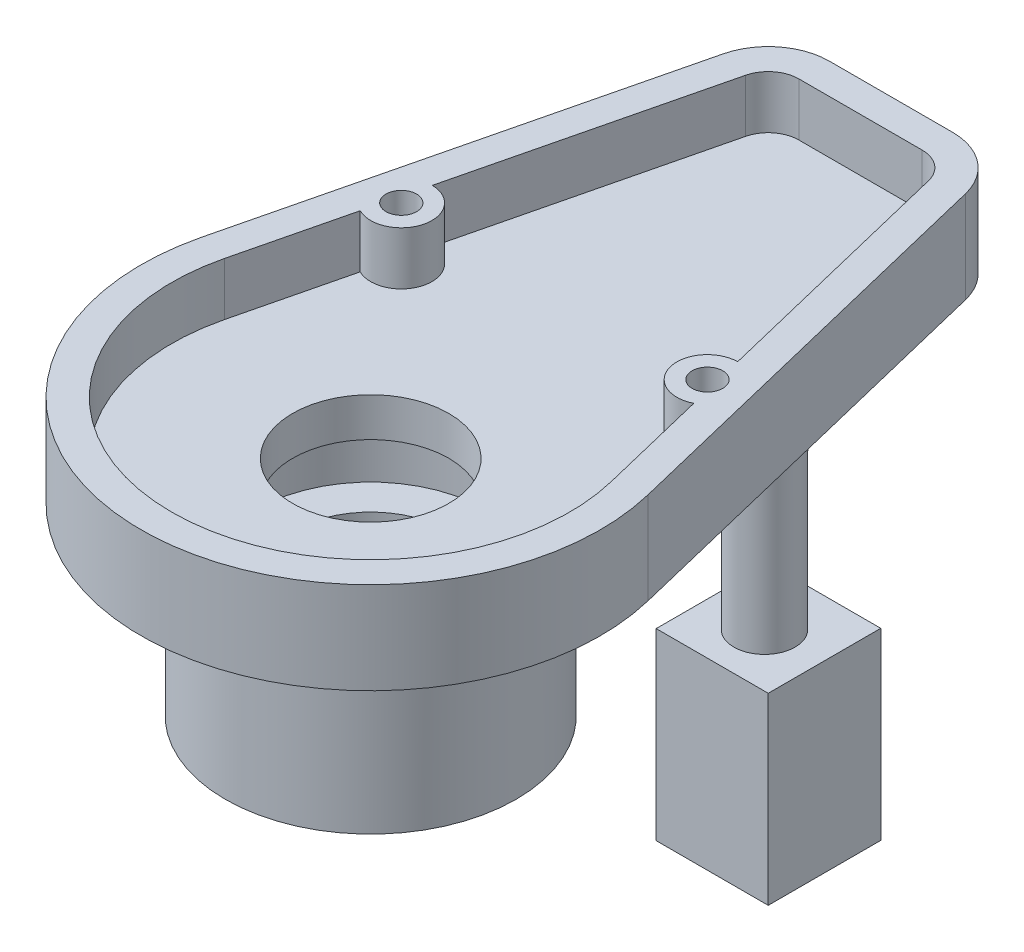
ISO-10303-21;
HEADER;
FILE_DESCRIPTION(('STEP AP214'),'2;1');
FILE_NAME('part.step','',(''),(''),'','','');
FILE_SCHEMA(('AUTOMOTIVE_DESIGN { 1 0 10303 214 1 1 1 1 }'));
ENDSEC;
DATA;
#1=APPLICATION_CONTEXT('core data for automotive mechanical design processes');
#2=APPLICATION_PROTOCOL_DEFINITION('international standard','automotive_design',2000,#1);
#3=PRODUCT_CONTEXT('',#1,'mechanical');
#4=PRODUCT('Part','Part','',(#3));
#5=PRODUCT_RELATED_PRODUCT_CATEGORY('part','',(#4));
#6=PRODUCT_DEFINITION_FORMATION('','',#4);
#7=PRODUCT_DEFINITION_CONTEXT('part definition',#1,'design');
#8=PRODUCT_DEFINITION('design','',#6,#7);
#9=PRODUCT_DEFINITION_SHAPE('','',#8);
#10=(LENGTH_UNIT() NAMED_UNIT(*) SI_UNIT(.MILLI.,.METRE.));
#11=(NAMED_UNIT(*) PLANE_ANGLE_UNIT() SI_UNIT($,.RADIAN.));
#12=(NAMED_UNIT(*) SI_UNIT($,.STERADIAN.) SOLID_ANGLE_UNIT());
#13=UNCERTAINTY_MEASURE_WITH_UNIT(LENGTH_MEASURE(1.E-05),#10,'distance_accuracy_value','');
#14=(GEOMETRIC_REPRESENTATION_CONTEXT(3) GLOBAL_UNCERTAINTY_ASSIGNED_CONTEXT((#13)) GLOBAL_UNIT_ASSIGNED_CONTEXT((#10,
#11,#12)) REPRESENTATION_CONTEXT('',''));
#15=CARTESIAN_POINT('',(0.,0.,0.));
#16=DIRECTION('',(0.,0.,1.));
#17=DIRECTION('',(1.,0.,0.));
#18=AXIS2_PLACEMENT_3D('',#15,#16,#17);
#19=CARTESIAN_POINT('',(0.,-0.06,0.));
#20=DIRECTION('',(0.,1.,0.));
#21=DIRECTION('',(0.,0.,1.));
#22=AXIS2_PLACEMENT_3D('',#19,#20,#21);
#23=CYLINDRICAL_SURFACE('',#22,0.0375);
#24=CARTESIAN_POINT('',(0.,0.,0.));
#25=DIRECTION('',(0.,-1.,0.));
#26=DIRECTION('',(0.,0.,-1.));
#27=AXIS2_PLACEMENT_3D('',#24,#25,#26);
#28=CIRCLE('',#27,0.0375);
#29=CARTESIAN_POINT('',(0.,0.,-0.0375));
#30=VERTEX_POINT('',#29);
#31=EDGE_CURVE('E217',#30,#30,#28,.T.);
#32=ORIENTED_EDGE('',*,*,#31,.F.);
#33=EDGE_LOOP('',(#32));
#34=FACE_BOUND('',#33,.T.);
#35=CARTESIAN_POINT('',(0.,-0.0205,0.));
#36=DIRECTION('',(0.,-1.,0.));
#37=DIRECTION('',(0.,0.,-1.));
#38=AXIS2_PLACEMENT_3D('',#35,#36,#37);
#39=CIRCLE('',#38,0.0375);
#40=CARTESIAN_POINT('',(0.,-0.0205,-0.0375));
#41=VERTEX_POINT('',#40);
#42=EDGE_CURVE('E213',#41,#41,#39,.T.);
#43=ORIENTED_EDGE('',*,*,#42,.T.);
#44=EDGE_LOOP('',(#43));
#45=FACE_BOUND('',#44,.T.);
#46=ADVANCED_FACE('F39',(#34,#45),#23,.F.);
#47=CARTESIAN_POINT('',(-0.0201396002808026,0.,-0.15));
#48=DIRECTION('',(0.,1.,0.));
#49=DIRECTION('',(0.,0.,1.));
#50=AXIS2_PLACEMENT_3D('',#47,#48,#49);
#51=PLANE('',#50);
#52=CARTESIAN_POINT('',(0.,0.,0.));
#53=DIRECTION('',(0.,-1.,0.));
#54=DIRECTION('',(0.,0.,-1.));
#55=AXIS2_PLACEMENT_3D('',#52,#53,#54);
#56=CIRCLE('',#55,0.0255);
#57=CARTESIAN_POINT('',(0.,0.,-0.0255));
#58=VERTEX_POINT('',#57);
#59=EDGE_CURVE('E230',#58,#58,#56,.T.);
#60=ORIENTED_EDGE('',*,*,#59,.F.);
#61=EDGE_LOOP('',(#60));
#62=FACE_BOUND('',#61,.T.);
#63=ORIENTED_EDGE('',*,*,#31,.T.);
#64=EDGE_LOOP('',(#63));
#65=FACE_BOUND('',#64,.T.);
#66=ADVANCED_FACE('F394',(#62,#65),#51,.F.);
#67=CARTESIAN_POINT('',(-0.05,0.03,-0.06));
#68=DIRECTION('',(0.,-1.,0.));
#69=DIRECTION('',(0.,0.,-1.));
#70=AXIS2_PLACEMENT_3D('',#67,#68,#69);
#71=CYLINDRICAL_SURFACE('',#70,0.005);
#72=CARTESIAN_POINT('',(-0.05,0.03,-0.06));
#73=DIRECTION('',(0.,1.,0.));
#74=DIRECTION('',(0.,0.,1.));
#75=AXIS2_PLACEMENT_3D('',#72,#73,#74);
#76=CIRCLE('',#75,0.005);
#77=CARTESIAN_POINT('',(-0.05,0.03,-0.055));
#78=VERTEX_POINT('',#77);
#79=EDGE_CURVE('E312',#78,#78,#76,.T.);
#80=ORIENTED_EDGE('',*,*,#79,.T.);
#81=EDGE_LOOP('',(#80));
#82=FACE_BOUND('',#81,.T.);
#83=CARTESIAN_POINT('',(-0.05,0.0127,-0.06));
#84=DIRECTION('',(0.,-1.,0.));
#85=DIRECTION('',(0.,0.,-1.));
#86=AXIS2_PLACEMENT_3D('',#83,#84,#85);
#87=CIRCLE('',#86,0.005);
#88=CARTESIAN_POINT('',(-0.05,0.0127,-0.065));
#89=VERTEX_POINT('',#88);
#90=EDGE_CURVE('E261',#89,#89,#87,.T.);
#91=ORIENTED_EDGE('',*,*,#90,.T.);
#92=EDGE_LOOP('',(#91));
#93=FACE_BOUND('',#92,.T.);
#94=ADVANCED_FACE('F400',(#82,#93),#71,.F.);
#95=CARTESIAN_POINT('',(0.05,0.03,-0.06));
#96=DIRECTION('',(0.,-1.,0.));
#97=DIRECTION('',(0.,0.,-1.));
#98=AXIS2_PLACEMENT_3D('',#95,#96,#97);
#99=CYLINDRICAL_SURFACE('',#98,0.005);
#100=CARTESIAN_POINT('',(0.05,0.03,-0.06));
#101=DIRECTION('',(0.,1.,0.));
#102=DIRECTION('',(0.,0.,1.));
#103=AXIS2_PLACEMENT_3D('',#100,#101,#102);
#104=CIRCLE('',#103,0.005);
#105=CARTESIAN_POINT('',(0.05,0.03,-0.055));
#106=VERTEX_POINT('',#105);
#107=EDGE_CURVE('E315',#106,#106,#104,.T.);
#108=ORIENTED_EDGE('',*,*,#107,.T.);
#109=EDGE_LOOP('',(#108));
#110=FACE_BOUND('',#109,.T.);
#111=CARTESIAN_POINT('',(0.05,0.0127,-0.06));
#112=DIRECTION('',(0.,-1.,0.));
#113=DIRECTION('',(0.,0.,-1.));
#114=AXIS2_PLACEMENT_3D('',#111,#112,#113);
#115=CIRCLE('',#114,0.005);
#116=CARTESIAN_POINT('',(0.05,0.0127,-0.065));
#117=VERTEX_POINT('',#116);
#118=EDGE_CURVE('E256',#117,#117,#115,.T.);
#119=ORIENTED_EDGE('',*,*,#118,.T.);
#120=EDGE_LOOP('',(#119));
#121=FACE_BOUND('',#120,.T.);
#122=ADVANCED_FACE('F548',(#110,#121),#99,.F.);
#123=CARTESIAN_POINT('',(0.,0.03,0.));
#124=DIRECTION('',(0.,-1.,0.));
#125=DIRECTION('',(0.,0.,-1.));
#126=AXIS2_PLACEMENT_3D('',#123,#124,#125);
#127=CYLINDRICAL_SURFACE('',#126,0.0650000000000001);
#128=DIRECTION('',(0.,-1.,0.));
#129=VECTOR('',#128,1.);
#130=CARTESIAN_POINT('',(0.0631607616090124,0.03,-0.0153531167184229));
#131=LINE('',#130,#129);
#132=CARTESIAN_POINT('',(0.0631607616090124,0.03,-0.0153531167184229));
#133=VERTEX_POINT('',#132);
#134=CARTESIAN_POINT('',(0.0631607616090124,0.0127,-0.0153531167184229));
#135=VERTEX_POINT('',#134);
#136=EDGE_CURVE('E310',#133,#135,#131,.T.);
#137=ORIENTED_EDGE('',*,*,#136,.T.);
#138=CARTESIAN_POINT('',(0.,0.0127,0.));
#139=DIRECTION('',(0.,-1.,0.));
#140=DIRECTION('',(0.,0.,-1.));
#141=AXIS2_PLACEMENT_3D('',#138,#139,#140);
#142=CIRCLE('',#141,0.0650000000000001);
#143=CARTESIAN_POINT('',(-0.0631607616090123,0.0127,-0.0153531167184228));
#144=VERTEX_POINT('',#143);
#145=EDGE_CURVE('E254',#135,#144,#142,.T.);
#146=ORIENTED_EDGE('',*,*,#145,.T.);
#147=DIRECTION('',(0.,-1.,0.));
#148=VECTOR('',#147,1.);
#149=CARTESIAN_POINT('',(-0.0631607616090123,0.03,-0.0153531167184228));
#150=LINE('',#149,#148);
#151=CARTESIAN_POINT('',(-0.0631607616090123,0.03,-0.0153531167184228));
#152=VERTEX_POINT('',#151);
#153=EDGE_CURVE('E282',#152,#144,#150,.T.);
#154=ORIENTED_EDGE('',*,*,#153,.F.);
#155=CARTESIAN_POINT('',(0.,0.03,0.));
#156=DIRECTION('',(0.,1.,0.));
#157=DIRECTION('',(0.,0.,1.));
#158=AXIS2_PLACEMENT_3D('',#155,#156,#157);
#159=CIRCLE('',#158,0.0650000000000001);
#160=EDGE_CURVE('E262',#152,#133,#159,.T.);
#161=ORIENTED_EDGE('',*,*,#160,.T.);
#162=EDGE_LOOP('',(#137,#146,#154,#161));
#163=FACE_BOUND('',#162,.T.);
#164=ADVANCED_FACE('F559',(#163),#127,.F.);
#165=CARTESIAN_POINT('',(0.054481082767001,0.03,-0.0510602070921477));
#166=DIRECTION('',(-0.971704024754036,0.,0.236201795668044));
#167=DIRECTION('',(0.236201795668044,0.,0.971704024754036));
#168=AXIS2_PLACEMENT_3D('',#165,#166,#167);
#169=PLANE('',#168);
#170=DIRECTION('',(0.,-1.,0.));
#171=VECTOR('',#170,1.);
#172=CARTESIAN_POINT('',(0.054481082767001,0.03,-0.0510602070921477));
#173=LINE('',#172,#171);
#174=CARTESIAN_POINT('',(0.054481082767001,0.03,-0.0510602070921477));
#175=VERTEX_POINT('',#174);
#176=CARTESIAN_POINT('',(0.054481082767001,0.0127,-0.0510602070921477));
#177=VERTEX_POINT('',#176);
#178=EDGE_CURVE('E308',#175,#177,#173,.T.);
#179=ORIENTED_EDGE('',*,*,#178,.T.);
#180=DIRECTION('',(0.236201795668044,0.,0.971704024754036));
#181=VECTOR('',#180,1.);
#182=CARTESIAN_POINT('',(0.054481082767001,0.0127,-0.0510602070921477));
#183=LINE('',#182,#181);
#184=EDGE_CURVE('E252',#177,#135,#183,.T.);
#185=ORIENTED_EDGE('',*,*,#184,.T.);
#186=ORIENTED_EDGE('',*,*,#136,.F.);
#187=DIRECTION('',(-0.236201795668044,0.,-0.971704024754036));
#188=VECTOR('',#187,1.);
#189=CARTESIAN_POINT('',(0.054481082767001,0.03,-0.0510602070921477));
#190=LINE('',#189,#188);
#191=EDGE_CURVE('E266',#133,#175,#190,.T.);
#192=ORIENTED_EDGE('',*,*,#191,.T.);
#193=EDGE_LOOP('',(#179,#185,#186,#192));
#194=FACE_BOUND('',#193,.T.);
#195=ADVANCED_FACE('F568',(#194),#169,.T.);
#196=CARTESIAN_POINT('',(0.05,0.03,-0.06));
#197=DIRECTION('',(0.,-1.,0.));
#198=DIRECTION('',(0.,0.,-1.));
#199=AXIS2_PLACEMENT_3D('',#196,#197,#198);
#200=CYLINDRICAL_SURFACE('',#199,0.01);
#201=DIRECTION('',(0.,-1.,0.));
#202=VECTOR('',#201,1.);
#203=CARTESIAN_POINT('',(0.0498773810181324,0.03,-0.0699992482010042));
#204=LINE('',#203,#202);
#205=CARTESIAN_POINT('',(0.0498773810181324,0.03,-0.0699992482010042));
#206=VERTEX_POINT('',#205);
#207=CARTESIAN_POINT('',(0.0498773810181324,0.0127,-0.0699992482010042));
#208=VERTEX_POINT('',#207);
#209=EDGE_CURVE('E302',#206,#208,#204,.T.);
#210=ORIENTED_EDGE('',*,*,#209,.T.);
#211=CARTESIAN_POINT('',(0.05,0.0127,-0.06));
#212=DIRECTION('',(0.,-1.,0.));
#213=DIRECTION('',(0.,0.,-1.));
#214=AXIS2_PLACEMENT_3D('',#211,#212,#213);
#215=CIRCLE('',#214,0.01);
#216=EDGE_CURVE('E250',#208,#177,#215,.F.);
#217=ORIENTED_EDGE('',*,*,#216,.T.);
#218=ORIENTED_EDGE('',*,*,#178,.F.);
#219=CARTESIAN_POINT('',(0.05,0.03,-0.06));
#220=DIRECTION('',(0.,-1.,0.));
#221=DIRECTION('',(0.,0.,1.));
#222=AXIS2_PLACEMENT_3D('',#219,#220,#221);
#223=CIRCLE('',#222,0.01);
#224=EDGE_CURVE('E268',#175,#206,#223,.T.);
#225=ORIENTED_EDGE('',*,*,#224,.T.);
#226=EDGE_LOOP('',(#210,#217,#218,#225));
#227=FACE_BOUND('',#226,.T.);
#228=ADVANCED_FACE('F576',(#227),#200,.T.);
#229=CARTESIAN_POINT('',(0.029856640528343,0.03,-0.15236201795668));
#230=DIRECTION('',(-0.971704024754036,0.,0.236201795668044));
#231=DIRECTION('',(0.236201795668044,0.,0.971704024754036));
#232=AXIS2_PLACEMENT_3D('',#229,#230,#231);
#233=PLANE('',#232);
#234=DIRECTION('',(0.,-1.,0.));
#235=VECTOR('',#234,1.);
#236=CARTESIAN_POINT('',(0.029856640528343,0.03,-0.15236201795668));
#237=LINE('',#236,#235);
#238=CARTESIAN_POINT('',(0.029856640528343,0.03,-0.15236201795668));
#239=VERTEX_POINT('',#238);
#240=CARTESIAN_POINT('',(0.029856640528343,0.0127,-0.15236201795668));
#241=VERTEX_POINT('',#240);
#242=EDGE_CURVE('E299',#239,#241,#237,.T.);
#243=ORIENTED_EDGE('',*,*,#242,.T.);
#244=DIRECTION('',(0.236201795668044,0.,0.971704024754036));
#245=VECTOR('',#244,1.);
#246=CARTESIAN_POINT('',(0.029856640528343,0.0127,-0.15236201795668));
#247=LINE('',#246,#245);
#248=EDGE_CURVE('E248',#241,#208,#247,.T.);
#249=ORIENTED_EDGE('',*,*,#248,.T.);
#250=ORIENTED_EDGE('',*,*,#209,.F.);
#251=DIRECTION('',(-0.236201795668044,0.,-0.971704024754036));
#252=VECTOR('',#251,1.);
#253=CARTESIAN_POINT('',(0.029856640528343,0.03,-0.15236201795668));
#254=LINE('',#253,#252);
#255=EDGE_CURVE('E269',#206,#239,#254,.T.);
#256=ORIENTED_EDGE('',*,*,#255,.T.);
#257=EDGE_LOOP('',(#243,#249,#250,#256));
#258=FACE_BOUND('',#257,.T.);
#259=ADVANCED_FACE('F587',(#258),#233,.T.);
#260=CARTESIAN_POINT('',(0.0201396002808026,0.03,-0.15));
#261=DIRECTION('',(0.,-1.,0.));
#262=DIRECTION('',(0.,0.,-1.));
#263=AXIS2_PLACEMENT_3D('',#260,#261,#262);
#264=CYLINDRICAL_SURFACE('',#263,0.01);
#265=DIRECTION('',(0.,-1.,0.));
#266=VECTOR('',#265,1.);
#267=CARTESIAN_POINT('',(0.0201396002808026,0.03,-0.16));
#268=LINE('',#267,#266);
#269=CARTESIAN_POINT('',(0.0201396002808026,0.03,-0.16));
#270=VERTEX_POINT('',#269);
#271=CARTESIAN_POINT('',(0.0201396002808026,0.0127,-0.16));
#272=VERTEX_POINT('',#271);
#273=EDGE_CURVE('E300',#270,#272,#268,.T.);
#274=ORIENTED_EDGE('',*,*,#273,.T.);
#275=CARTESIAN_POINT('',(0.0201396002808026,0.0127,-0.15));
#276=DIRECTION('',(0.,-1.,0.));
#277=DIRECTION('',(0.,0.,-1.));
#278=AXIS2_PLACEMENT_3D('',#275,#276,#277);
#279=CIRCLE('',#278,0.01);
#280=EDGE_CURVE('E241',#272,#241,#279,.T.);
#281=ORIENTED_EDGE('',*,*,#280,.T.);
#282=ORIENTED_EDGE('',*,*,#242,.F.);
#283=CARTESIAN_POINT('',(0.0201396002808026,0.03,-0.15));
#284=DIRECTION('',(0.,1.,0.));
#285=DIRECTION('',(0.,0.,-1.));
#286=AXIS2_PLACEMENT_3D('',#283,#284,#285);
#287=CIRCLE('',#286,0.01);
#288=EDGE_CURVE('E275',#239,#270,#287,.T.);
#289=ORIENTED_EDGE('',*,*,#288,.T.);
#290=EDGE_LOOP('',(#274,#281,#282,#289));
#291=FACE_BOUND('',#290,.T.);
#292=ADVANCED_FACE('F599',(#291),#264,.F.);
#293=CARTESIAN_POINT('',(0.0201396002808026,0.03,-0.16));
#294=DIRECTION('',(0.,0.,1.));
#295=DIRECTION('',(1.,0.,0.));
#296=AXIS2_PLACEMENT_3D('',#293,#294,#295);
#297=PLANE('',#296);
#298=DIRECTION('',(0.,-1.,0.));
#299=VECTOR('',#298,1.);
#300=CARTESIAN_POINT('',(-0.0201396002808026,0.03,-0.16));
#301=LINE('',#300,#299);
#302=CARTESIAN_POINT('',(-0.0201396002808026,0.03,-0.16));
#303=VERTEX_POINT('',#302);
#304=CARTESIAN_POINT('',(-0.0201396002808026,0.0127,-0.16));
#305=VERTEX_POINT('',#304);
#306=EDGE_CURVE('E294',#303,#305,#301,.T.);
#307=ORIENTED_EDGE('',*,*,#306,.T.);
#308=DIRECTION('',(1.,0.,0.));
#309=VECTOR('',#308,1.);
#310=CARTESIAN_POINT('',(0.0201396002808026,0.0127,-0.16));
#311=LINE('',#310,#309);
#312=EDGE_CURVE('E238',#305,#272,#311,.T.);
#313=ORIENTED_EDGE('',*,*,#312,.T.);
#314=ORIENTED_EDGE('',*,*,#273,.F.);
#315=DIRECTION('',(-1.,0.,0.));
#316=VECTOR('',#315,1.);
#317=CARTESIAN_POINT('',(0.0201396002808026,0.03,-0.16));
#318=LINE('',#317,#316);
#319=EDGE_CURVE('E273',#270,#303,#318,.T.);
#320=ORIENTED_EDGE('',*,*,#319,.T.);
#321=EDGE_LOOP('',(#307,#313,#314,#320));
#322=FACE_BOUND('',#321,.T.);
#323=ADVANCED_FACE('F608',(#322),#297,.T.);
#324=CARTESIAN_POINT('',(-0.0201396002808026,0.03,-0.15));
#325=DIRECTION('',(0.,-1.,0.));
#326=DIRECTION('',(0.,0.,-1.));
#327=AXIS2_PLACEMENT_3D('',#324,#325,#326);
#328=CYLINDRICAL_SURFACE('',#327,0.01);
#329=DIRECTION('',(0.,-1.,0.));
#330=VECTOR('',#329,1.);
#331=CARTESIAN_POINT('',(-0.029856640528343,0.03,-0.15236201795668));
#332=LINE('',#331,#330);
#333=CARTESIAN_POINT('',(-0.029856640528343,0.03,-0.15236201795668));
#334=VERTEX_POINT('',#333);
#335=CARTESIAN_POINT('',(-0.029856640528343,0.0127,-0.15236201795668));
#336=VERTEX_POINT('',#335);
#337=EDGE_CURVE('E292',#334,#336,#332,.T.);
#338=ORIENTED_EDGE('',*,*,#337,.T.);
#339=CARTESIAN_POINT('',(-0.0201396002808026,0.0127,-0.15));
#340=DIRECTION('',(0.,-1.,0.));
#341=DIRECTION('',(0.,0.,-1.));
#342=AXIS2_PLACEMENT_3D('',#339,#340,#341);
#343=CIRCLE('',#342,0.01);
#344=EDGE_CURVE('E240',#336,#305,#343,.T.);
#345=ORIENTED_EDGE('',*,*,#344,.T.);
#346=ORIENTED_EDGE('',*,*,#306,.F.);
#347=CARTESIAN_POINT('',(-0.0201396002808026,0.03,-0.15));
#348=DIRECTION('',(0.,1.,0.));
#349=DIRECTION('',(0.,0.,1.));
#350=AXIS2_PLACEMENT_3D('',#347,#348,#349);
#351=CIRCLE('',#350,0.01);
#352=EDGE_CURVE('E277',#303,#334,#351,.T.);
#353=ORIENTED_EDGE('',*,*,#352,.T.);
#354=EDGE_LOOP('',(#338,#345,#346,#353));
#355=FACE_BOUND('',#354,.T.);
#356=ADVANCED_FACE('F616',(#355),#328,.F.);
#357=CARTESIAN_POINT('',(-0.029856640528343,0.03,-0.15236201795668));
#358=DIRECTION('',(0.971704024754036,0.,0.236201795668044));
#359=DIRECTION('',(0.236201795668044,0.,-0.971704024754036));
#360=AXIS2_PLACEMENT_3D('',#357,#358,#359);
#361=PLANE('',#360);
#362=DIRECTION('',(0.,-1.,0.));
#363=VECTOR('',#362,1.);
#364=CARTESIAN_POINT('',(-0.0498773810181323,0.03,-0.0699992482010042));
#365=LINE('',#364,#363);
#366=CARTESIAN_POINT('',(-0.0498773810181323,0.03,-0.0699992482010042));
#367=VERTEX_POINT('',#366);
#368=CARTESIAN_POINT('',(-0.0498773810181323,0.0127,-0.0699992482010042));
#369=VERTEX_POINT('',#368);
#370=EDGE_CURVE('E287',#367,#369,#365,.T.);
#371=ORIENTED_EDGE('',*,*,#370,.T.);
#372=DIRECTION('',(0.236201795668044,0.,-0.971704024754036));
#373=VECTOR('',#372,1.);
#374=CARTESIAN_POINT('',(-0.029856640528343,0.0127,-0.15236201795668));
#375=LINE('',#374,#373);
#376=EDGE_CURVE('E235',#369,#336,#375,.T.);
#377=ORIENTED_EDGE('',*,*,#376,.T.);
#378=ORIENTED_EDGE('',*,*,#337,.F.);
#379=DIRECTION('',(-0.236201795668044,0.,0.971704024754036));
#380=VECTOR('',#379,1.);
#381=CARTESIAN_POINT('',(-0.029856640528343,0.03,-0.15236201795668));
#382=LINE('',#381,#380);
#383=EDGE_CURVE('E279',#334,#367,#382,.T.);
#384=ORIENTED_EDGE('',*,*,#383,.T.);
#385=EDGE_LOOP('',(#371,#377,#378,#384));
#386=FACE_BOUND('',#385,.T.);
#387=ADVANCED_FACE('F629',(#386),#361,.T.);
#388=CARTESIAN_POINT('',(-0.05,0.03,-0.06));
#389=DIRECTION('',(0.,-1.,0.));
#390=DIRECTION('',(0.,0.,-1.));
#391=AXIS2_PLACEMENT_3D('',#388,#389,#390);
#392=CYLINDRICAL_SURFACE('',#391,0.01);
#393=DIRECTION('',(0.,-1.,0.));
#394=VECTOR('',#393,1.);
#395=CARTESIAN_POINT('',(-0.0544810827670009,0.03,-0.0510602070921476));
#396=LINE('',#395,#394);
#397=CARTESIAN_POINT('',(-0.0544810827670009,0.03,-0.0510602070921476));
#398=VERTEX_POINT('',#397);
#399=CARTESIAN_POINT('',(-0.0544810827670009,0.0127,-0.0510602070921476));
#400=VERTEX_POINT('',#399);
#401=EDGE_CURVE('E63',#398,#400,#396,.T.);
#402=ORIENTED_EDGE('',*,*,#401,.T.);
#403=CARTESIAN_POINT('',(-0.05,0.0127,-0.06));
#404=DIRECTION('',(0.,-1.,0.));
#405=DIRECTION('',(0.,0.,-1.));
#406=AXIS2_PLACEMENT_3D('',#403,#404,#405);
#407=CIRCLE('',#406,0.01);
#408=EDGE_CURVE('E53',#400,#369,#407,.F.);
#409=ORIENTED_EDGE('',*,*,#408,.T.);
#410=ORIENTED_EDGE('',*,*,#370,.F.);
#411=CARTESIAN_POINT('',(-0.05,0.03,-0.06));
#412=DIRECTION('',(0.,-1.,0.));
#413=DIRECTION('',(0.,0.,1.));
#414=AXIS2_PLACEMENT_3D('',#411,#412,#413);
#415=CIRCLE('',#414,0.01);
#416=EDGE_CURVE('E278',#367,#398,#415,.T.);
#417=ORIENTED_EDGE('',*,*,#416,.T.);
#418=EDGE_LOOP('',(#402,#409,#410,#417));
#419=FACE_BOUND('',#418,.T.);
#420=ADVANCED_FACE('F639',(#419),#392,.T.);
#421=CARTESIAN_POINT('',(-0.0544810827670009,0.03,-0.0510602070921476));
#422=DIRECTION('',(0.971704024754036,0.,0.236201795668044));
#423=DIRECTION('',(0.236201795668044,0.,-0.971704024754036));
#424=AXIS2_PLACEMENT_3D('',#421,#422,#423);
#425=PLANE('',#424);
#426=ORIENTED_EDGE('',*,*,#153,.T.);
#427=DIRECTION('',(0.236201795668044,0.,-0.971704024754036));
#428=VECTOR('',#427,1.);
#429=CARTESIAN_POINT('',(-0.0544810827670009,0.0127,-0.0510602070921476));
#430=LINE('',#429,#428);
#431=EDGE_CURVE('E363',#144,#400,#430,.T.);
#432=ORIENTED_EDGE('',*,*,#431,.T.);
#433=ORIENTED_EDGE('',*,*,#401,.F.);
#434=DIRECTION('',(-0.236201795668044,0.,0.971704024754036));
#435=VECTOR('',#434,1.);
#436=CARTESIAN_POINT('',(-0.0544810827670009,0.03,-0.0510602070921476));
#437=LINE('',#436,#435);
#438=EDGE_CURVE('E285',#398,#152,#437,.T.);
#439=ORIENTED_EDGE('',*,*,#438,.T.);
#440=EDGE_LOOP('',(#426,#432,#433,#439));
#441=FACE_BOUND('',#440,.T.);
#442=ADVANCED_FACE('F649',(#441),#425,.T.);
#443=CARTESIAN_POINT('',(-0.0201396002808026,0.03,-0.15));
#444=DIRECTION('',(0.,1.,0.));
#445=DIRECTION('',(0.,0.,1.));
#446=AXIS2_PLACEMENT_3D('',#443,#444,#445);
#447=PLANE('',#446);
#448=ORIENTED_EDGE('',*,*,#79,.F.);
#449=EDGE_LOOP('',(#448));
#450=FACE_BOUND('',#449,.T.);
#451=CARTESIAN_POINT('',(-0.0201396002808026,0.03,-0.15));
#452=DIRECTION('',(0.,1.,0.));
#453=DIRECTION('',(0.,0.,1.));
#454=AXIS2_PLACEMENT_3D('',#451,#452,#453);
#455=CIRCLE('',#454,0.02);
#456=CARTESIAN_POINT('',(-0.0201396002808026,0.03,-0.17));
#457=VERTEX_POINT('',#456);
#458=CARTESIAN_POINT('',(-0.0395736807758834,0.03,-0.154724035913361));
#459=VERTEX_POINT('',#458);
#460=EDGE_CURVE('E317',#457,#459,#455,.T.);
#461=ORIENTED_EDGE('',*,*,#460,.T.);
#462=DIRECTION('',(-0.236201795668044,0.,0.971704024754036));
#463=VECTOR('',#462,1.);
#464=CARTESIAN_POINT('',(-0.0395736807758834,0.03,-0.154724035913361));
#465=LINE('',#464,#463);
#466=CARTESIAN_POINT('',(-0.0728778018565527,0.03,-0.0177151346751033));
#467=VERTEX_POINT('',#466);
#468=EDGE_CURVE('E325',#459,#467,#465,.T.);
#469=ORIENTED_EDGE('',*,*,#468,.T.);
#470=CARTESIAN_POINT('',(0.,0.03,0.));
#471=DIRECTION('',(0.,1.,0.));
#472=DIRECTION('',(0.,0.,1.));
#473=AXIS2_PLACEMENT_3D('',#470,#471,#472);
#474=CIRCLE('',#473,0.075);
#475=CARTESIAN_POINT('',(0.0728778018565527,0.03,-0.0177151346751033));
#476=VERTEX_POINT('',#475);
#477=EDGE_CURVE('E324',#467,#476,#474,.T.);
#478=ORIENTED_EDGE('',*,*,#477,.T.);
#479=DIRECTION('',(-0.236201795668044,0.,-0.971704024754036));
#480=VECTOR('',#479,1.);
#481=CARTESIAN_POINT('',(0.0395736807758834,0.03,-0.154724035913361));
#482=LINE('',#481,#480);
#483=CARTESIAN_POINT('',(0.0395736807758834,0.03,-0.154724035913361));
#484=VERTEX_POINT('',#483);
#485=EDGE_CURVE('E330',#476,#484,#482,.T.);
#486=ORIENTED_EDGE('',*,*,#485,.T.);
#487=CARTESIAN_POINT('',(0.0201396002808026,0.03,-0.15));
#488=DIRECTION('',(0.,1.,0.));
#489=DIRECTION('',(0.,0.,-1.));
#490=AXIS2_PLACEMENT_3D('',#487,#488,#489);
#491=CIRCLE('',#490,0.02);
#492=CARTESIAN_POINT('',(0.0201396002808025,0.03,-0.17));
#493=VERTEX_POINT('',#492);
#494=EDGE_CURVE('E328',#484,#493,#491,.T.);
#495=ORIENTED_EDGE('',*,*,#494,.T.);
#496=DIRECTION('',(-1.,0.,0.));
#497=VECTOR('',#496,1.);
#498=CARTESIAN_POINT('',(0.0201396002808025,0.03,-0.17));
#499=LINE('',#498,#497);
#500=EDGE_CURVE('E332',#493,#457,#499,.T.);
#501=ORIENTED_EDGE('',*,*,#500,.T.);
#502=EDGE_LOOP('',(#461,#469,#478,#486,#495,#501));
#503=FACE_BOUND('',#502,.T.);
#504=ORIENTED_EDGE('',*,*,#107,.F.);
#505=EDGE_LOOP('',(#504));
#506=FACE_BOUND('',#505,.T.);
#507=ORIENTED_EDGE('',*,*,#191,.F.);
#508=ORIENTED_EDGE('',*,*,#160,.F.);
#509=ORIENTED_EDGE('',*,*,#438,.F.);
#510=ORIENTED_EDGE('',*,*,#416,.F.);
#511=ORIENTED_EDGE('',*,*,#383,.F.);
#512=ORIENTED_EDGE('',*,*,#352,.F.);
#513=ORIENTED_EDGE('',*,*,#319,.F.);
#514=ORIENTED_EDGE('',*,*,#288,.F.);
#515=ORIENTED_EDGE('',*,*,#255,.F.);
#516=ORIENTED_EDGE('',*,*,#224,.F.);
#517=EDGE_LOOP('',(#507,#508,#509,#510,#511,#512,#513,#514,#515,#516));
#518=FACE_BOUND('',#517,.T.);
#519=ADVANCED_FACE('F659',(#450,#503,#506,#518),#447,.T.);
#520=CARTESIAN_POINT('',(0.,0.,-0.128635748518609));
#521=DIRECTION('',(0.,1.,0.));
#522=DIRECTION('',(0.,0.,1.));
#523=AXIS2_PLACEMENT_3D('',#520,#521,#522);
#524=CIRCLE('',#523,0.01);
#525=CARTESIAN_POINT('',(0.,0.,-0.118635748518609));
#526=VERTEX_POINT('',#525);
#527=EDGE_CURVE('E11',#526,#526,#524,.F.);
#528=ORIENTED_EDGE('',*,*,#527,.F.);
#529=EDGE_LOOP('',(#528));
#530=FACE_BOUND('',#529,.T.);
#531=CARTESIAN_POINT('',(0.,0.,0.));
#532=DIRECTION('',(0.,1.,0.));
#533=DIRECTION('',(0.,0.,1.));
#534=AXIS2_PLACEMENT_3D('',#531,#532,#533);
#535=CIRCLE('',#534,0.0475);
#536=CARTESIAN_POINT('',(0.,0.,0.0475));
#537=VERTEX_POINT('',#536);
#538=EDGE_CURVE('E361',#537,#537,#535,.F.);
#539=ORIENTED_EDGE('',*,*,#538,.F.);
#540=EDGE_LOOP('',(#539));
#541=FACE_BOUND('',#540,.T.);
#542=CARTESIAN_POINT('',(-0.0201396002808026,0.,-0.15));
#543=DIRECTION('',(0.,1.,0.));
#544=DIRECTION('',(0.,0.,1.));
#545=AXIS2_PLACEMENT_3D('',#542,#543,#544);
#546=CIRCLE('',#545,0.02);
#547=CARTESIAN_POINT('',(-0.0201396002808026,0.,-0.17));
#548=VERTEX_POINT('',#547);
#549=CARTESIAN_POINT('',(-0.0395736807758834,0.,-0.154724035913361));
#550=VERTEX_POINT('',#549);
#551=EDGE_CURVE('E318',#548,#550,#546,.T.);
#552=ORIENTED_EDGE('',*,*,#551,.F.);
#553=DIRECTION('',(-1.,0.,0.));
#554=VECTOR('',#553,1.);
#555=CARTESIAN_POINT('',(0.0201396002808025,0.,-0.17));
#556=LINE('',#555,#554);
#557=CARTESIAN_POINT('',(0.0201396002808025,0.,-0.17));
#558=VERTEX_POINT('',#557);
#559=EDGE_CURVE('E323',#558,#548,#556,.T.);
#560=ORIENTED_EDGE('',*,*,#559,.F.);
#561=CARTESIAN_POINT('',(0.0201396002808026,0.,-0.15));
#562=DIRECTION('',(0.,1.,0.));
#563=DIRECTION('',(0.,0.,-1.));
#564=AXIS2_PLACEMENT_3D('',#561,#562,#563);
#565=CIRCLE('',#564,0.02);
#566=CARTESIAN_POINT('',(0.0395736807758834,0.,-0.154724035913361));
#567=VERTEX_POINT('',#566);
#568=EDGE_CURVE('E341',#567,#558,#565,.T.);
#569=ORIENTED_EDGE('',*,*,#568,.F.);
#570=DIRECTION('',(-0.236201795668044,0.,-0.971704024754036));
#571=VECTOR('',#570,1.);
#572=CARTESIAN_POINT('',(0.0395736807758834,0.,-0.154724035913361));
#573=LINE('',#572,#571);
#574=CARTESIAN_POINT('',(0.0728778018565527,0.,-0.0177151346751033));
#575=VERTEX_POINT('',#574);
#576=EDGE_CURVE('E344',#575,#567,#573,.T.);
#577=ORIENTED_EDGE('',*,*,#576,.F.);
#578=CARTESIAN_POINT('',(0.,0.,0.));
#579=DIRECTION('',(0.,1.,0.));
#580=DIRECTION('',(0.,0.,1.));
#581=AXIS2_PLACEMENT_3D('',#578,#579,#580);
#582=CIRCLE('',#581,0.075);
#583=CARTESIAN_POINT('',(-0.0728778018565527,0.,-0.0177151346751033));
#584=VERTEX_POINT('',#583);
#585=EDGE_CURVE('E337',#584,#575,#582,.T.);
#586=ORIENTED_EDGE('',*,*,#585,.F.);
#587=DIRECTION('',(-0.236201795668044,0.,0.971704024754036));
#588=VECTOR('',#587,1.);
#589=CARTESIAN_POINT('',(-0.0395736807758834,0.,-0.154724035913361));
#590=LINE('',#589,#588);
#591=EDGE_CURVE('E338',#550,#584,#590,.T.);
#592=ORIENTED_EDGE('',*,*,#591,.F.);
#593=EDGE_LOOP('',(#552,#560,#569,#577,#586,#592));
#594=FACE_BOUND('',#593,.T.);
#595=ADVANCED_FACE('F405',(#530,#541,#594),#51,.F.);
#596=CARTESIAN_POINT('',(-0.0201396002808026,0.03,-0.15));
#597=DIRECTION('',(0.,-1.,0.));
#598=DIRECTION('',(0.,0.,-1.));
#599=AXIS2_PLACEMENT_3D('',#596,#597,#598);
#600=CYLINDRICAL_SURFACE('',#599,0.02);
#601=ORIENTED_EDGE('',*,*,#551,.T.);
#602=DIRECTION('',(0.,-1.,0.));
#603=VECTOR('',#602,1.);
#604=CARTESIAN_POINT('',(-0.0395736807758834,0.03,-0.154724035913361));
#605=LINE('',#604,#603);
#606=EDGE_CURVE('E360',#459,#550,#605,.T.);
#607=ORIENTED_EDGE('',*,*,#606,.F.);
#608=ORIENTED_EDGE('',*,*,#460,.F.);
#609=DIRECTION('',(0.,-1.,0.));
#610=VECTOR('',#609,1.);
#611=CARTESIAN_POINT('',(-0.0201396002808026,0.03,-0.17));
#612=LINE('',#611,#610);
#613=EDGE_CURVE('E334',#457,#548,#612,.T.);
#614=ORIENTED_EDGE('',*,*,#613,.T.);
#615=EDGE_LOOP('',(#601,#607,#608,#614));
#616=FACE_BOUND('',#615,.T.);
#617=ADVANCED_FACE('F41',(#616),#600,.T.);
#618=CARTESIAN_POINT('',(-0.0395736807758834,0.03,-0.154724035913361));
#619=DIRECTION('',(0.971704024754036,0.,0.236201795668044));
#620=DIRECTION('',(0.236201795668044,0.,-0.971704024754036));
#621=AXIS2_PLACEMENT_3D('',#618,#619,#620);
#622=PLANE('',#621);
#623=ORIENTED_EDGE('',*,*,#591,.T.);
#624=DIRECTION('',(0.,-1.,0.));
#625=VECTOR('',#624,1.);
#626=CARTESIAN_POINT('',(-0.0728778018565527,0.03,-0.0177151346751033));
#627=LINE('',#626,#625);
#628=EDGE_CURVE('E359',#467,#584,#627,.T.);
#629=ORIENTED_EDGE('',*,*,#628,.F.);
#630=ORIENTED_EDGE('',*,*,#468,.F.);
#631=ORIENTED_EDGE('',*,*,#606,.T.);
#632=EDGE_LOOP('',(#623,#629,#630,#631));
#633=FACE_BOUND('',#632,.T.);
#634=ADVANCED_FACE('F700',(#633),#622,.F.);
#635=CARTESIAN_POINT('',(0.,0.03,0.));
#636=DIRECTION('',(0.,-1.,0.));
#637=DIRECTION('',(0.,0.,-1.));
#638=AXIS2_PLACEMENT_3D('',#635,#636,#637);
#639=CYLINDRICAL_SURFACE('',#638,0.075);
#640=ORIENTED_EDGE('',*,*,#585,.T.);
#641=DIRECTION('',(0.,-1.,0.));
#642=VECTOR('',#641,1.);
#643=CARTESIAN_POINT('',(0.0728778018565527,0.03,-0.0177151346751033));
#644=LINE('',#643,#642);
#645=EDGE_CURVE('E354',#476,#575,#644,.T.);
#646=ORIENTED_EDGE('',*,*,#645,.F.);
#647=ORIENTED_EDGE('',*,*,#477,.F.);
#648=ORIENTED_EDGE('',*,*,#628,.T.);
#649=EDGE_LOOP('',(#640,#646,#647,#648));
#650=FACE_BOUND('',#649,.T.);
#651=ADVANCED_FACE('F687',(#650),#639,.T.);
#652=CARTESIAN_POINT('',(0.0395736807758834,0.03,-0.154724035913361));
#653=DIRECTION('',(-0.971704024754036,0.,0.236201795668044));
#654=DIRECTION('',(0.236201795668044,0.,0.971704024754036));
#655=AXIS2_PLACEMENT_3D('',#652,#653,#654);
#656=PLANE('',#655);
#657=ORIENTED_EDGE('',*,*,#576,.T.);
#658=DIRECTION('',(0.,-1.,0.));
#659=VECTOR('',#658,1.);
#660=CARTESIAN_POINT('',(0.0395736807758834,0.03,-0.154724035913361));
#661=LINE('',#660,#659);
#662=EDGE_CURVE('E351',#484,#567,#661,.T.);
#663=ORIENTED_EDGE('',*,*,#662,.F.);
#664=ORIENTED_EDGE('',*,*,#485,.F.);
#665=ORIENTED_EDGE('',*,*,#645,.T.);
#666=EDGE_LOOP('',(#657,#663,#664,#665));
#667=FACE_BOUND('',#666,.T.);
#668=ADVANCED_FACE('F679',(#667),#656,.F.);
#669=CARTESIAN_POINT('',(0.0201396002808026,0.03,-0.15));
#670=DIRECTION('',(0.,-1.,0.));
#671=DIRECTION('',(0.,0.,-1.));
#672=AXIS2_PLACEMENT_3D('',#669,#670,#671);
#673=CYLINDRICAL_SURFACE('',#672,0.02);
#674=ORIENTED_EDGE('',*,*,#568,.T.);
#675=DIRECTION('',(0.,-1.,0.));
#676=VECTOR('',#675,1.);
#677=CARTESIAN_POINT('',(0.0201396002808025,0.03,-0.17));
#678=LINE('',#677,#676);
#679=EDGE_CURVE('E353',#493,#558,#678,.T.);
#680=ORIENTED_EDGE('',*,*,#679,.F.);
#681=ORIENTED_EDGE('',*,*,#494,.F.);
#682=ORIENTED_EDGE('',*,*,#662,.T.);
#683=EDGE_LOOP('',(#674,#680,#681,#682));
#684=FACE_BOUND('',#683,.T.);
#685=ADVANCED_FACE('F669',(#684),#673,.T.);
#686=CARTESIAN_POINT('',(0.0201396002808025,0.03,-0.17));
#687=DIRECTION('',(0.,0.,1.));
#688=DIRECTION('',(1.,0.,0.));
#689=AXIS2_PLACEMENT_3D('',#686,#687,#688);
#690=PLANE('',#689);
#691=ORIENTED_EDGE('',*,*,#559,.T.);
#692=ORIENTED_EDGE('',*,*,#613,.F.);
#693=ORIENTED_EDGE('',*,*,#500,.F.);
#694=ORIENTED_EDGE('',*,*,#679,.T.);
#695=EDGE_LOOP('',(#691,#692,#693,#694));
#696=FACE_BOUND('',#695,.T.);
#697=ADVANCED_FACE('F537',(#696),#690,.F.);
#698=CARTESIAN_POINT('',(0.,0.0127,0.));
#699=DIRECTION('',(0.,-1.,0.));
#700=DIRECTION('',(0.,0.,-1.));
#701=AXIS2_PLACEMENT_3D('',#698,#699,#700);
#702=CYLINDRICAL_SURFACE('',#701,0.0255);
#703=CARTESIAN_POINT('',(0.,0.0127,0.));
#704=DIRECTION('',(0.,-1.,0.));
#705=DIRECTION('',(0.,0.,-1.));
#706=AXIS2_PLACEMENT_3D('',#703,#704,#705);
#707=CIRCLE('',#706,0.0255);
#708=CARTESIAN_POINT('',(0.,0.0127,-0.0255));
#709=VERTEX_POINT('',#708);
#710=EDGE_CURVE('E226',#709,#709,#707,.T.);
#711=ORIENTED_EDGE('',*,*,#710,.F.);
#712=EDGE_LOOP('',(#711));
#713=FACE_BOUND('',#712,.T.);
#714=ORIENTED_EDGE('',*,*,#59,.T.);
#715=EDGE_LOOP('',(#714));
#716=FACE_BOUND('',#715,.T.);
#717=ADVANCED_FACE('F535',(#713,#716),#702,.F.);
#718=CARTESIAN_POINT('',(-0.0201396002808026,0.0127,-0.15));
#719=DIRECTION('',(0.,-1.,0.));
#720=DIRECTION('',(0.,0.,-1.));
#721=AXIS2_PLACEMENT_3D('',#718,#719,#720);
#722=PLANE('',#721);
#723=ORIENTED_EDGE('',*,*,#145,.F.);
#724=ORIENTED_EDGE('',*,*,#184,.F.);
#725=ORIENTED_EDGE('',*,*,#216,.F.);
#726=ORIENTED_EDGE('',*,*,#248,.F.);
#727=ORIENTED_EDGE('',*,*,#280,.F.);
#728=ORIENTED_EDGE('',*,*,#312,.F.);
#729=ORIENTED_EDGE('',*,*,#344,.F.);
#730=ORIENTED_EDGE('',*,*,#376,.F.);
#731=ORIENTED_EDGE('',*,*,#408,.F.);
#732=ORIENTED_EDGE('',*,*,#431,.F.);
#733=EDGE_LOOP('',(#723,#724,#725,#726,#727,#728,#729,#730,#731,#732));
#734=FACE_BOUND('',#733,.T.);
#735=ORIENTED_EDGE('',*,*,#710,.T.);
#736=EDGE_LOOP('',(#735));
#737=FACE_BOUND('',#736,.T.);
#738=ADVANCED_FACE('F391',(#734,#737),#722,.F.);
#739=ORIENTED_EDGE('',*,*,#118,.F.);
#740=EDGE_LOOP('',(#739));
#741=FACE_BOUND('',#740,.T.);
#742=ADVANCED_FACE('F388',(#741),#722,.F.);
#743=ORIENTED_EDGE('',*,*,#90,.F.);
#744=EDGE_LOOP('',(#743));
#745=FACE_BOUND('',#744,.T.);
#746=ADVANCED_FACE('F379',(#745),#722,.F.);
#747=CARTESIAN_POINT('',(0.,-0.06,0.));
#748=DIRECTION('',(0.,-1.,0.));
#749=DIRECTION('',(0.,0.,-1.));
#750=AXIS2_PLACEMENT_3D('',#747,#748,#749);
#751=PLANE('',#750);
#752=CARTESIAN_POINT('',(0.,-0.06,0.));
#753=DIRECTION('',(0.,-1.,0.));
#754=DIRECTION('',(0.,0.,-1.));
#755=AXIS2_PLACEMENT_3D('',#752,#753,#754);
#756=CIRCLE('',#755,0.0475);
#757=CARTESIAN_POINT('',(0.,-0.06,-0.0475));
#758=VERTEX_POINT('',#757);
#759=EDGE_CURVE('E225',#758,#758,#756,.T.);
#760=ORIENTED_EDGE('',*,*,#759,.T.);
#761=EDGE_LOOP('',(#760));
#762=FACE_BOUND('',#761,.T.);
#763=CARTESIAN_POINT('',(0.,-0.06,0.));
#764=DIRECTION('',(0.,-1.,0.));
#765=DIRECTION('',(0.,0.,-1.));
#766=AXIS2_PLACEMENT_3D('',#763,#764,#765);
#767=CIRCLE('',#766,0.0375);
#768=CARTESIAN_POINT('',(0.,-0.06,-0.0375));
#769=VERTEX_POINT('',#768);
#770=EDGE_CURVE('E218',#769,#769,#767,.T.);
#771=ORIENTED_EDGE('',*,*,#770,.F.);
#772=EDGE_LOOP('',(#771));
#773=FACE_BOUND('',#772,.T.);
#774=ADVANCED_FACE('F378',(#762,#773),#751,.T.);
#775=CARTESIAN_POINT('',(0.,-0.06,0.));
#776=DIRECTION('',(0.,1.,0.));
#777=DIRECTION('',(0.,0.,1.));
#778=AXIS2_PLACEMENT_3D('',#775,#776,#777);
#779=CYLINDRICAL_SURFACE('',#778,0.0475);
#780=ORIENTED_EDGE('',*,*,#759,.F.);
#781=EDGE_LOOP('',(#780));
#782=FACE_BOUND('',#781,.T.);
#783=ORIENTED_EDGE('',*,*,#538,.T.);
#784=EDGE_LOOP('',(#783));
#785=FACE_BOUND('',#784,.T.);
#786=ADVANCED_FACE('F372',(#782,#785),#779,.T.);
#787=CARTESIAN_POINT('',(0.,-0.04576,0.));
#788=DIRECTION('',(0.,-1.,0.));
#789=DIRECTION('',(0.,0.,-1.));
#790=AXIS2_PLACEMENT_3D('',#787,#788,#789);
#791=CIRCLE('',#790,0.0375);
#792=CARTESIAN_POINT('',(0.,-0.04576,-0.0375));
#793=VERTEX_POINT('',#792);
#794=EDGE_CURVE('E50',#793,#793,#791,.T.);
#795=ORIENTED_EDGE('',*,*,#794,.F.);
#796=EDGE_LOOP('',(#795));
#797=FACE_BOUND('',#796,.T.);
#798=ORIENTED_EDGE('',*,*,#770,.T.);
#799=EDGE_LOOP('',(#798));
#800=FACE_BOUND('',#799,.T.);
#801=ADVANCED_FACE('F371',(#797,#800),#23,.F.);
#802=CARTESIAN_POINT('',(0.,-0.04576,0.));
#803=DIRECTION('',(0.,-1.,0.));
#804=DIRECTION('',(0.,0.,-1.));
#805=AXIS2_PLACEMENT_3D('',#802,#803,#804);
#806=PLANE('',#805);
#807=ORIENTED_EDGE('',*,*,#794,.T.);
#808=EDGE_LOOP('',(#807));
#809=FACE_BOUND('',#808,.T.);
#810=CARTESIAN_POINT('',(0.,-0.04576,0.));
#811=DIRECTION('',(0.,-1.,0.));
#812=DIRECTION('',(0.,0.,-1.));
#813=AXIS2_PLACEMENT_3D('',#810,#811,#812);
#814=CIRCLE('',#813,0.0255);
#815=CARTESIAN_POINT('',(0.,-0.04576,-0.0255));
#816=VERTEX_POINT('',#815);
#817=EDGE_CURVE('E209',#816,#816,#814,.T.);
#818=ORIENTED_EDGE('',*,*,#817,.F.);
#819=EDGE_LOOP('',(#818));
#820=FACE_BOUND('',#819,.T.);
#821=ADVANCED_FACE('F366',(#809,#820),#806,.T.);
#822=CARTESIAN_POINT('',(0.,-0.0205,0.));
#823=DIRECTION('',(0.,-1.,0.));
#824=DIRECTION('',(0.,0.,-1.));
#825=AXIS2_PLACEMENT_3D('',#822,#823,#824);
#826=PLANE('',#825);
#827=ORIENTED_EDGE('',*,*,#42,.F.);
#828=EDGE_LOOP('',(#827));
#829=FACE_BOUND('',#828,.T.);
#830=CARTESIAN_POINT('',(0.,-0.0205,0.));
#831=DIRECTION('',(0.,-1.,0.));
#832=DIRECTION('',(0.,0.,-1.));
#833=AXIS2_PLACEMENT_3D('',#830,#831,#832);
#834=CIRCLE('',#833,0.0255);
#835=CARTESIAN_POINT('',(0.,-0.0205,-0.0255));
#836=VERTEX_POINT('',#835);
#837=EDGE_CURVE('E204',#836,#836,#834,.T.);
#838=ORIENTED_EDGE('',*,*,#837,.T.);
#839=EDGE_LOOP('',(#838));
#840=FACE_BOUND('',#839,.T.);
#841=ADVANCED_FACE('F408',(#829,#840),#826,.F.);
#842=CARTESIAN_POINT('',(0.,-0.04576,0.));
#843=DIRECTION('',(0.,1.,0.));
#844=DIRECTION('',(0.,0.,1.));
#845=AXIS2_PLACEMENT_3D('',#842,#843,#844);
#846=CYLINDRICAL_SURFACE('',#845,0.0255);
#847=ORIENTED_EDGE('',*,*,#817,.T.);
#848=EDGE_LOOP('',(#847));
#849=FACE_BOUND('',#848,.T.);
#850=ORIENTED_EDGE('',*,*,#837,.F.);
#851=EDGE_LOOP('',(#850));
#852=FACE_BOUND('',#851,.T.);
#853=ADVANCED_FACE('F407',(#849,#852),#846,.F.);
#854=CARTESIAN_POINT('',(0.,-0.1,-0.128635748518609));
#855=DIRECTION('',(0.,1.,0.));
#856=DIRECTION('',(0.,0.,1.));
#857=AXIS2_PLACEMENT_3D('',#854,#855,#856);
#858=CYLINDRICAL_SURFACE('',#857,0.01);
#859=CARTESIAN_POINT('',(0.,-0.1,-0.128635748518609));
#860=DIRECTION('',(0.,-1.,0.));
#861=DIRECTION('',(0.,0.,-1.));
#862=AXIS2_PLACEMENT_3D('',#859,#860,#861);
#863=CIRCLE('',#862,0.01);
#864=CARTESIAN_POINT('',(0.,-0.1,-0.138635748518609));
#865=VERTEX_POINT('',#864);
#866=EDGE_CURVE('E203',#865,#865,#863,.T.);
#867=ORIENTED_EDGE('',*,*,#866,.F.);
#868=EDGE_LOOP('',(#867));
#869=FACE_BOUND('',#868,.T.);
#870=ORIENTED_EDGE('',*,*,#527,.T.);
#871=EDGE_LOOP('',(#870));
#872=FACE_BOUND('',#871,.T.);
#873=ADVANCED_FACE('F411',(#869,#872),#858,.T.);
#874=CARTESIAN_POINT('',(-0.0179397006397657,-0.16,-0.111196044591454));
#875=DIRECTION('',(1.,0.,0.));
#876=DIRECTION('',(0.,0.,-1.));
#877=AXIS2_PLACEMENT_3D('',#874,#875,#876);
#878=PLANE('',#877);
#879=DIRECTION('',(0.,0.,-1.));
#880=VECTOR('',#879,1.);
#881=CARTESIAN_POINT('',(-0.0179397006397657,-0.1,-0.111196044591454));
#882=LINE('',#881,#880);
#883=CARTESIAN_POINT('',(-0.0179397006397657,-0.1,-0.111196044591454));
#884=VERTEX_POINT('',#883);
#885=CARTESIAN_POINT('',(-0.0179397006397657,-0.1,-0.147953187934036));
#886=VERTEX_POINT('',#885);
#887=EDGE_CURVE('E199',#884,#886,#882,.T.);
#888=ORIENTED_EDGE('',*,*,#887,.T.);
#889=DIRECTION('',(0.,1.,0.));
#890=VECTOR('',#889,1.);
#891=CARTESIAN_POINT('',(-0.0179397006397657,-0.16,-0.147953187934036));
#892=LINE('',#891,#890);
#893=CARTESIAN_POINT('',(-0.0179397006397657,-0.16,-0.147953187934036));
#894=VERTEX_POINT('',#893);
#895=EDGE_CURVE('E176',#894,#886,#892,.T.);
#896=ORIENTED_EDGE('',*,*,#895,.F.);
#897=DIRECTION('',(0.,0.,-1.));
#898=VECTOR('',#897,1.);
#899=CARTESIAN_POINT('',(-0.0179397006397657,-0.16,-0.111196044591454));
#900=LINE('',#899,#898);
#901=CARTESIAN_POINT('',(-0.0179397006397657,-0.16,-0.111196044591454));
#902=VERTEX_POINT('',#901);
#903=EDGE_CURVE('E190',#902,#894,#900,.T.);
#904=ORIENTED_EDGE('',*,*,#903,.F.);
#905=DIRECTION('',(0.,1.,0.));
#906=VECTOR('',#905,1.);
#907=CARTESIAN_POINT('',(-0.0179397006397657,-0.16,-0.111196044591454));
#908=LINE('',#907,#906);
#909=EDGE_CURVE('E825',#902,#884,#908,.T.);
#910=ORIENTED_EDGE('',*,*,#909,.T.);
#911=EDGE_LOOP('',(#888,#896,#904,#910));
#912=FACE_BOUND('',#911,.T.);
#913=ADVANCED_FACE('F196',(#912),#878,.F.);
#914=CARTESIAN_POINT('',(-0.0179397006397657,-0.16,-0.147953187934036));
#915=DIRECTION('',(0.,0.,1.));
#916=DIRECTION('',(1.,0.,0.));
#917=AXIS2_PLACEMENT_3D('',#914,#915,#916);
#918=PLANE('',#917);
#919=DIRECTION('',(1.,0.,0.));
#920=VECTOR('',#919,1.);
#921=CARTESIAN_POINT('',(-0.0179397006397657,-0.1,-0.147953187934036));
#922=LINE('',#921,#920);
#923=CARTESIAN_POINT('',(0.0186597613756057,-0.1,-0.147953187934036));
#924=VERTEX_POINT('',#923);
#925=EDGE_CURVE('E813',#886,#924,#922,.T.);
#926=ORIENTED_EDGE('',*,*,#925,.T.);
#927=DIRECTION('',(0.,1.,0.));
#928=VECTOR('',#927,1.);
#929=CARTESIAN_POINT('',(0.0186597613756057,-0.16,-0.147953187934036));
#930=LINE('',#929,#928);
#931=CARTESIAN_POINT('',(0.0186597613756057,-0.16,-0.147953187934036));
#932=VERTEX_POINT('',#931);
#933=EDGE_CURVE('E181',#932,#924,#930,.T.);
#934=ORIENTED_EDGE('',*,*,#933,.F.);
#935=DIRECTION('',(1.,0.,0.));
#936=VECTOR('',#935,1.);
#937=CARTESIAN_POINT('',(-0.0179397006397657,-0.16,-0.147953187934036));
#938=LINE('',#937,#936);
#939=EDGE_CURVE('E178',#894,#932,#938,.T.);
#940=ORIENTED_EDGE('',*,*,#939,.F.);
#941=ORIENTED_EDGE('',*,*,#895,.T.);
#942=EDGE_LOOP('',(#926,#934,#940,#941));
#943=FACE_BOUND('',#942,.T.);
#944=ADVANCED_FACE('F177',(#943),#918,.F.);
#945=CARTESIAN_POINT('',(0.0186597613756057,-0.16,-0.111196044591454));
#946=DIRECTION('',(-1.,0.,0.));
#947=DIRECTION('',(0.,0.,1.));
#948=AXIS2_PLACEMENT_3D('',#945,#946,#947);
#949=PLANE('',#948);
#950=DIRECTION('',(0.,0.,1.));
#951=VECTOR('',#950,1.);
#952=CARTESIAN_POINT('',(0.0186597613756057,-0.1,-0.111196044591454));
#953=LINE('',#952,#951);
#954=CARTESIAN_POINT('',(0.0186597613756057,-0.1,-0.111196044591454));
#955=VERTEX_POINT('',#954);
#956=EDGE_CURVE('E814',#924,#955,#953,.T.);
#957=ORIENTED_EDGE('',*,*,#956,.T.);
#958=DIRECTION('',(0.,1.,0.));
#959=VECTOR('',#958,1.);
#960=CARTESIAN_POINT('',(0.0186597613756057,-0.16,-0.111196044591454));
#961=LINE('',#960,#959);
#962=CARTESIAN_POINT('',(0.0186597613756057,-0.16,-0.111196044591454));
#963=VERTEX_POINT('',#962);
#964=EDGE_CURVE('E206',#963,#955,#961,.T.);
#965=ORIENTED_EDGE('',*,*,#964,.F.);
#966=DIRECTION('',(0.,0.,1.));
#967=VECTOR('',#966,1.);
#968=CARTESIAN_POINT('',(0.0186597613756057,-0.16,-0.111196044591454));
#969=LINE('',#968,#967);
#970=EDGE_CURVE('E188',#932,#963,#969,.T.);
#971=ORIENTED_EDGE('',*,*,#970,.F.);
#972=ORIENTED_EDGE('',*,*,#933,.T.);
#973=EDGE_LOOP('',(#957,#965,#971,#972));
#974=FACE_BOUND('',#973,.T.);
#975=ADVANCED_FACE('F424',(#974),#949,.F.);
#976=CARTESIAN_POINT('',(-0.0179397006397657,-0.16,-0.111196044591454));
#977=DIRECTION('',(0.,0.,-1.));
#978=DIRECTION('',(-1.,0.,0.));
#979=AXIS2_PLACEMENT_3D('',#976,#977,#978);
#980=PLANE('',#979);
#981=DIRECTION('',(-1.,0.,0.));
#982=VECTOR('',#981,1.);
#983=CARTESIAN_POINT('',(-0.0179397006397657,-0.1,-0.111196044591454));
#984=LINE('',#983,#982);
#985=EDGE_CURVE('E198',#955,#884,#984,.T.);
#986=ORIENTED_EDGE('',*,*,#985,.T.);
#987=ORIENTED_EDGE('',*,*,#909,.F.);
#988=DIRECTION('',(-1.,0.,0.));
#989=VECTOR('',#988,1.);
#990=CARTESIAN_POINT('',(-0.0179397006397657,-0.16,-0.111196044591454));
#991=LINE('',#990,#989);
#992=EDGE_CURVE('E194',#963,#902,#991,.T.);
#993=ORIENTED_EDGE('',*,*,#992,.F.);
#994=ORIENTED_EDGE('',*,*,#964,.T.);
#995=EDGE_LOOP('',(#986,#987,#993,#994));
#996=FACE_BOUND('',#995,.T.);
#997=ADVANCED_FACE('F430',(#996),#980,.F.);
#998=CARTESIAN_POINT('',(0.,-0.16,0.));
#999=DIRECTION('',(0.,-1.,0.));
#1000=DIRECTION('',(0.,0.,-1.));
#1001=AXIS2_PLACEMENT_3D('',#998,#999,#1000);
#1002=PLANE('',#1001);
#1003=ORIENTED_EDGE('',*,*,#903,.T.);
#1004=ORIENTED_EDGE('',*,*,#939,.T.);
#1005=ORIENTED_EDGE('',*,*,#970,.T.);
#1006=ORIENTED_EDGE('',*,*,#992,.T.);
#1007=EDGE_LOOP('',(#1003,#1004,#1005,#1006));
#1008=FACE_BOUND('',#1007,.T.);
#1009=ADVANCED_FACE('F189',(#1008),#1002,.T.);
#1010=CARTESIAN_POINT('',(0.,-0.1,0.));
#1011=DIRECTION('',(0.,-1.,0.));
#1012=DIRECTION('',(0.,0.,-1.));
#1013=AXIS2_PLACEMENT_3D('',#1010,#1011,#1012);
#1014=PLANE('',#1013);
#1015=ORIENTED_EDGE('',*,*,#866,.T.);
#1016=EDGE_LOOP('',(#1015));
#1017=FACE_BOUND('',#1016,.T.);
#1018=ORIENTED_EDGE('',*,*,#887,.F.);
#1019=ORIENTED_EDGE('',*,*,#985,.F.);
#1020=ORIENTED_EDGE('',*,*,#956,.F.);
#1021=ORIENTED_EDGE('',*,*,#925,.F.);
#1022=EDGE_LOOP('',(#1018,#1019,#1020,#1021));
#1023=FACE_BOUND('',#1022,.T.);
#1024=ADVANCED_FACE('F435',(#1017,#1023),#1014,.F.);
#1025=CLOSED_SHELL('',(#46,#66,#94,#122,#164,#195,#228,#259,#292,#323,#356,#387,#420,#442,#519,
#595,#617,#634,#651,#668,#685,#697,#717,#738,#742,#746,#774,#786,#801,#821,#841,#853,#873,#913,
#944,#975,#997,#1009,#1024));
#1026=MANIFOLD_SOLID_BREP('B2',#1025);
#1027=ADVANCED_BREP_SHAPE_REPRESENTATION('',(#18,#1026),#14);
#1028=SHAPE_DEFINITION_REPRESENTATION(#9,#1027);
ENDSEC;
END-ISO-10303-21;
